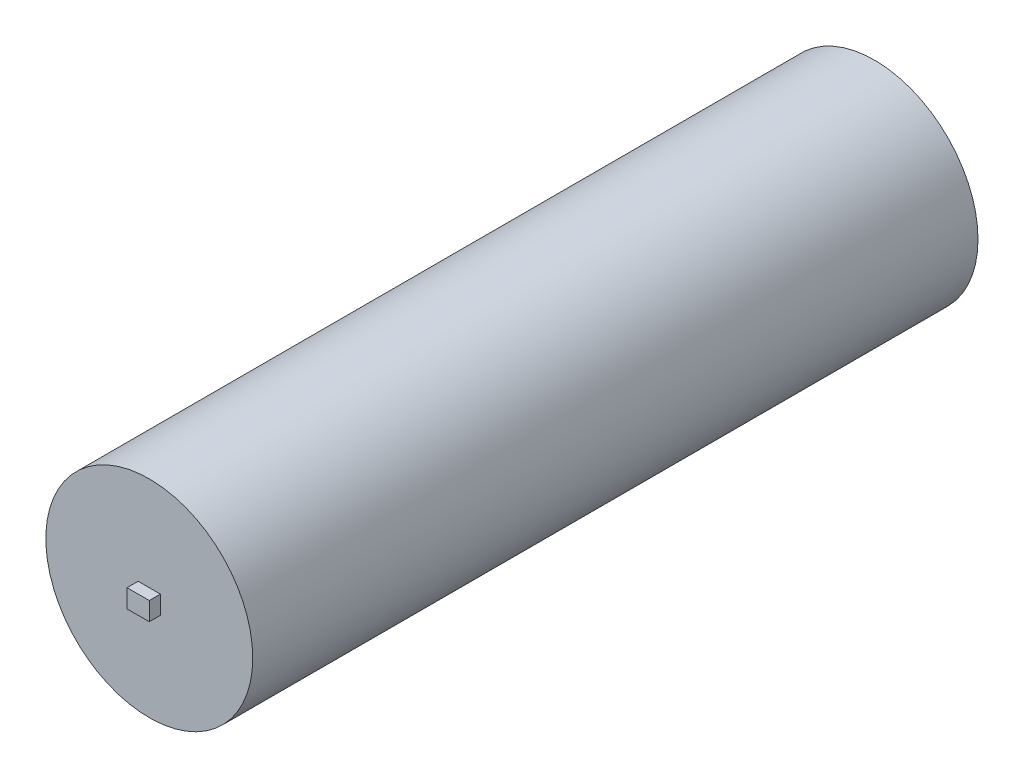
ISO-10303-21;
HEADER;
FILE_DESCRIPTION(('STEP AP214'),'2;1');
FILE_NAME('part.step','',(''),(''),'','','');
FILE_SCHEMA(('AUTOMOTIVE_DESIGN { 1 0 10303 214 1 1 1 1 }'));
ENDSEC;
DATA;
#1=APPLICATION_CONTEXT('core data for automotive mechanical design processes');
#2=APPLICATION_PROTOCOL_DEFINITION('international standard','automotive_design',2000,#1);
#3=PRODUCT_CONTEXT('',#1,'mechanical');
#4=PRODUCT('Part','Part','',(#3));
#5=PRODUCT_RELATED_PRODUCT_CATEGORY('part','',(#4));
#6=PRODUCT_DEFINITION_FORMATION('','',#4);
#7=PRODUCT_DEFINITION_CONTEXT('part definition',#1,'design');
#8=PRODUCT_DEFINITION('design','',#6,#7);
#9=PRODUCT_DEFINITION_SHAPE('','',#8);
#10=(LENGTH_UNIT() NAMED_UNIT(*) SI_UNIT(.MILLI.,.METRE.));
#11=(NAMED_UNIT(*) PLANE_ANGLE_UNIT() SI_UNIT($,.RADIAN.));
#12=(NAMED_UNIT(*) SI_UNIT($,.STERADIAN.) SOLID_ANGLE_UNIT());
#13=UNCERTAINTY_MEASURE_WITH_UNIT(LENGTH_MEASURE(1.E-05),#10,'distance_accuracy_value','');
#14=(GEOMETRIC_REPRESENTATION_CONTEXT(3) GLOBAL_UNCERTAINTY_ASSIGNED_CONTEXT((#13)) GLOBAL_UNIT_ASSIGNED_CONTEXT((#10,
#11,#12)) REPRESENTATION_CONTEXT('',''));
#15=CARTESIAN_POINT('',(0.,0.,0.));
#16=DIRECTION('',(0.,0.,1.));
#17=DIRECTION('',(1.,0.,0.));
#18=AXIS2_PLACEMENT_3D('',#15,#16,#17);
#19=CARTESIAN_POINT('',(0.,0.,32.6));
#20=DIRECTION('',(0.,0.,1.));
#21=DIRECTION('',(1.,0.,0.));
#22=AXIS2_PLACEMENT_3D('',#19,#20,#21);
#23=PLANE('',#22);
#24=CARTESIAN_POINT('',(0.,0.,32.6));
#25=DIRECTION('',(0.,0.,1.));
#26=DIRECTION('',(1.,0.,0.));
#27=AXIS2_PLACEMENT_3D('',#24,#25,#26);
#28=CIRCLE('',#27,9.3);
#29=CARTESIAN_POINT('',(9.3,0.,32.6));
#30=VERTEX_POINT('',#29);
#31=EDGE_CURVE('E11',#30,#30,#28,.T.);
#32=ORIENTED_EDGE('',*,*,#31,.T.);
#33=EDGE_LOOP('',(#32));
#34=FACE_BOUND('',#33,.T.);
#35=DIRECTION('',(-1.,0.,0.));
#36=VECTOR('',#35,1.);
#37=CARTESIAN_POINT('',(-1.,0.825860878421736,32.6));
#38=LINE('',#37,#36);
#39=CARTESIAN_POINT('',(1.,0.825860878421736,32.6));
#40=VERTEX_POINT('',#39);
#41=CARTESIAN_POINT('',(-1.,0.825860878421736,32.6));
#42=VERTEX_POINT('',#41);
#43=EDGE_CURVE('E94',#40,#42,#38,.T.);
#44=ORIENTED_EDGE('',*,*,#43,.F.);
#45=DIRECTION('',(0.,1.,0.));
#46=VECTOR('',#45,1.);
#47=CARTESIAN_POINT('',(1.,-0.825860878421736,32.6));
#48=LINE('',#47,#46);
#49=CARTESIAN_POINT('',(1.,-0.825860878421736,32.6));
#50=VERTEX_POINT('',#49);
#51=EDGE_CURVE('E105',#50,#40,#48,.T.);
#52=ORIENTED_EDGE('',*,*,#51,.F.);
#53=DIRECTION('',(1.,0.,0.));
#54=VECTOR('',#53,1.);
#55=CARTESIAN_POINT('',(-1.,-0.825860878421736,32.6));
#56=LINE('',#55,#54);
#57=CARTESIAN_POINT('',(-1.,-0.825860878421736,32.6));
#58=VERTEX_POINT('',#57);
#59=EDGE_CURVE('E75',#58,#50,#56,.T.);
#60=ORIENTED_EDGE('',*,*,#59,.F.);
#61=DIRECTION('',(0.,-1.,0.));
#62=VECTOR('',#61,1.);
#63=CARTESIAN_POINT('',(-1.,-0.825860878421736,32.6));
#64=LINE('',#63,#62);
#65=EDGE_CURVE('E109',#42,#58,#64,.T.);
#66=ORIENTED_EDGE('',*,*,#65,.F.);
#67=EDGE_LOOP('',(#44,#52,#60,#66));
#68=FACE_BOUND('',#67,.T.);
#69=ADVANCED_FACE('F38',(#34,#68),#23,.T.);
#70=CARTESIAN_POINT('',(0.,0.,32.6));
#71=DIRECTION('',(0.,0.,-1.));
#72=DIRECTION('',(-1.,0.,0.));
#73=AXIS2_PLACEMENT_3D('',#70,#71,#72);
#74=CYLINDRICAL_SURFACE('',#73,9.3);
#75=ORIENTED_EDGE('',*,*,#31,.F.);
#76=EDGE_LOOP('',(#75));
#77=FACE_BOUND('',#76,.T.);
#78=CARTESIAN_POINT('',(0.,0.,-32.6));
#79=DIRECTION('',(0.,0.,1.));
#80=DIRECTION('',(1.,0.,0.));
#81=AXIS2_PLACEMENT_3D('',#78,#79,#80);
#82=CIRCLE('',#81,9.3);
#83=CARTESIAN_POINT('',(9.3,0.,-32.6));
#84=VERTEX_POINT('',#83);
#85=EDGE_CURVE('E42',#84,#84,#82,.T.);
#86=ORIENTED_EDGE('',*,*,#85,.T.);
#87=EDGE_LOOP('',(#86));
#88=FACE_BOUND('',#87,.T.);
#89=ADVANCED_FACE('F40',(#77,#88),#74,.T.);
#90=CARTESIAN_POINT('',(0.,0.,-32.6));
#91=DIRECTION('',(0.,0.,1.));
#92=DIRECTION('',(1.,0.,0.));
#93=AXIS2_PLACEMENT_3D('',#90,#91,#92);
#94=PLANE('',#93);
#95=ORIENTED_EDGE('',*,*,#85,.F.);
#96=EDGE_LOOP('',(#95));
#97=FACE_BOUND('',#96,.T.);
#98=ADVANCED_FACE('F118',(#97),#94,.F.);
#99=CARTESIAN_POINT('',(1.,-0.825860878421736,33.6));
#100=DIRECTION('',(-1.,0.,0.));
#101=DIRECTION('',(0.,0.,1.));
#102=AXIS2_PLACEMENT_3D('',#99,#100,#101);
#103=PLANE('',#102);
#104=ORIENTED_EDGE('',*,*,#51,.T.);
#105=DIRECTION('',(0.,0.,-1.));
#106=VECTOR('',#105,1.);
#107=CARTESIAN_POINT('',(1.,0.825860878421736,33.6));
#108=LINE('',#107,#106);
#109=CARTESIAN_POINT('',(1.,0.825860878421736,33.6));
#110=VERTEX_POINT('',#109);
#111=EDGE_CURVE('E97',#110,#40,#108,.T.);
#112=ORIENTED_EDGE('',*,*,#111,.F.);
#113=DIRECTION('',(0.,1.,0.));
#114=VECTOR('',#113,1.);
#115=CARTESIAN_POINT('',(1.,-0.825860878421736,33.6));
#116=LINE('',#115,#114);
#117=CARTESIAN_POINT('',(1.,-0.825860878421736,33.6));
#118=VERTEX_POINT('',#117);
#119=EDGE_CURVE('E87',#118,#110,#116,.T.);
#120=ORIENTED_EDGE('',*,*,#119,.F.);
#121=DIRECTION('',(0.,0.,-1.));
#122=VECTOR('',#121,1.);
#123=CARTESIAN_POINT('',(1.,-0.825860878421736,33.6));
#124=LINE('',#123,#122);
#125=EDGE_CURVE('E101',#118,#50,#124,.T.);
#126=ORIENTED_EDGE('',*,*,#125,.T.);
#127=EDGE_LOOP('',(#104,#112,#120,#126));
#128=FACE_BOUND('',#127,.T.);
#129=ADVANCED_FACE('F120',(#128),#103,.F.);
#130=CARTESIAN_POINT('',(-1.,0.825860878421736,33.6));
#131=DIRECTION('',(0.,-1.,0.));
#132=DIRECTION('',(0.,0.,-1.));
#133=AXIS2_PLACEMENT_3D('',#130,#131,#132);
#134=PLANE('',#133);
#135=ORIENTED_EDGE('',*,*,#43,.T.);
#136=DIRECTION('',(0.,0.,-1.));
#137=VECTOR('',#136,1.);
#138=CARTESIAN_POINT('',(-1.,0.825860878421736,33.6));
#139=LINE('',#138,#137);
#140=CARTESIAN_POINT('',(-1.,0.825860878421736,33.6));
#141=VERTEX_POINT('',#140);
#142=EDGE_CURVE('E91',#141,#42,#139,.T.);
#143=ORIENTED_EDGE('',*,*,#142,.F.);
#144=DIRECTION('',(-1.,0.,0.));
#145=VECTOR('',#144,1.);
#146=CARTESIAN_POINT('',(-1.,0.825860878421736,33.6));
#147=LINE('',#146,#145);
#148=EDGE_CURVE('E82',#110,#141,#147,.T.);
#149=ORIENTED_EDGE('',*,*,#148,.F.);
#150=ORIENTED_EDGE('',*,*,#111,.T.);
#151=EDGE_LOOP('',(#135,#143,#149,#150));
#152=FACE_BOUND('',#151,.T.);
#153=ADVANCED_FACE('F92',(#152),#134,.F.);
#154=CARTESIAN_POINT('',(-1.,-0.825860878421736,33.6));
#155=DIRECTION('',(1.,0.,0.));
#156=DIRECTION('',(0.,0.,-1.));
#157=AXIS2_PLACEMENT_3D('',#154,#155,#156);
#158=PLANE('',#157);
#159=ORIENTED_EDGE('',*,*,#65,.T.);
#160=DIRECTION('',(0.,0.,-1.));
#161=VECTOR('',#160,1.);
#162=CARTESIAN_POINT('',(-1.,-0.825860878421736,33.6));
#163=LINE('',#162,#161);
#164=CARTESIAN_POINT('',(-1.,-0.825860878421736,33.6));
#165=VERTEX_POINT('',#164);
#166=EDGE_CURVE('E53',#165,#58,#163,.T.);
#167=ORIENTED_EDGE('',*,*,#166,.F.);
#168=DIRECTION('',(0.,-1.,0.));
#169=VECTOR('',#168,1.);
#170=CARTESIAN_POINT('',(-1.,-0.825860878421736,33.6));
#171=LINE('',#170,#169);
#172=EDGE_CURVE('E85',#141,#165,#171,.T.);
#173=ORIENTED_EDGE('',*,*,#172,.F.);
#174=ORIENTED_EDGE('',*,*,#142,.T.);
#175=EDGE_LOOP('',(#159,#167,#173,#174));
#176=FACE_BOUND('',#175,.T.);
#177=ADVANCED_FACE('F99',(#176),#158,.F.);
#178=CARTESIAN_POINT('',(-1.,-0.825860878421736,33.6));
#179=DIRECTION('',(0.,1.,0.));
#180=DIRECTION('',(0.,0.,1.));
#181=AXIS2_PLACEMENT_3D('',#178,#179,#180);
#182=PLANE('',#181);
#183=ORIENTED_EDGE('',*,*,#59,.T.);
#184=ORIENTED_EDGE('',*,*,#125,.F.);
#185=DIRECTION('',(1.,0.,0.));
#186=VECTOR('',#185,1.);
#187=CARTESIAN_POINT('',(-1.,-0.825860878421736,33.6));
#188=LINE('',#187,#186);
#189=EDGE_CURVE('E61',#165,#118,#188,.T.);
#190=ORIENTED_EDGE('',*,*,#189,.F.);
#191=ORIENTED_EDGE('',*,*,#166,.T.);
#192=EDGE_LOOP('',(#183,#184,#190,#191));
#193=FACE_BOUND('',#192,.T.);
#194=ADVANCED_FACE('F139',(#193),#182,.F.);
#195=CARTESIAN_POINT('',(0.,0.,33.6));
#196=DIRECTION('',(0.,0.,-1.));
#197=DIRECTION('',(-1.,0.,0.));
#198=AXIS2_PLACEMENT_3D('',#195,#196,#197);
#199=PLANE('',#198);
#200=ORIENTED_EDGE('',*,*,#119,.T.);
#201=ORIENTED_EDGE('',*,*,#148,.T.);
#202=ORIENTED_EDGE('',*,*,#172,.T.);
#203=ORIENTED_EDGE('',*,*,#189,.T.);
#204=EDGE_LOOP('',(#200,#201,#202,#203));
#205=FACE_BOUND('',#204,.T.);
#206=ADVANCED_FACE('F83',(#205),#199,.F.);
#207=CLOSED_SHELL('',(#69,#89,#98,#129,#153,#177,#194,#206));
#208=MANIFOLD_SOLID_BREP('B2',#207);
#209=ADVANCED_BREP_SHAPE_REPRESENTATION('',(#18,#208),#14);
#210=SHAPE_DEFINITION_REPRESENTATION(#9,#209);
ENDSEC;
END-ISO-10303-21;
